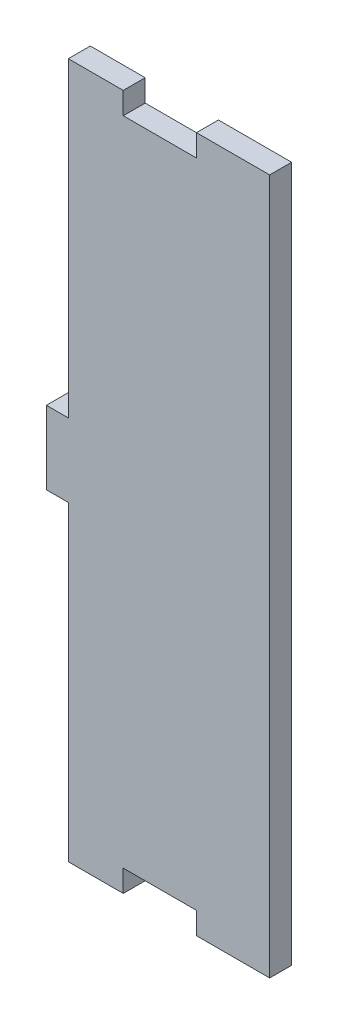
ISO-10303-21;
HEADER;
FILE_DESCRIPTION(('STEP AP214'),'2;1');
FILE_NAME('part.step','',(''),(''),'','','');
FILE_SCHEMA(('AUTOMOTIVE_DESIGN { 1 0 10303 214 1 1 1 1 }'));
ENDSEC;
DATA;
#1=APPLICATION_CONTEXT('core data for automotive mechanical design processes');
#2=APPLICATION_PROTOCOL_DEFINITION('international standard','automotive_design',2000,#1);
#3=PRODUCT_CONTEXT('',#1,'mechanical');
#4=PRODUCT('Part','Part','',(#3));
#5=PRODUCT_RELATED_PRODUCT_CATEGORY('part','',(#4));
#6=PRODUCT_DEFINITION_FORMATION('','',#4);
#7=PRODUCT_DEFINITION_CONTEXT('part definition',#1,'design');
#8=PRODUCT_DEFINITION('design','',#6,#7);
#9=PRODUCT_DEFINITION_SHAPE('','',#8);
#10=(LENGTH_UNIT() NAMED_UNIT(*) SI_UNIT(.MILLI.,.METRE.));
#11=(NAMED_UNIT(*) PLANE_ANGLE_UNIT() SI_UNIT($,.RADIAN.));
#12=(NAMED_UNIT(*) SI_UNIT($,.STERADIAN.) SOLID_ANGLE_UNIT());
#13=UNCERTAINTY_MEASURE_WITH_UNIT(LENGTH_MEASURE(1.E-05),#10,'distance_accuracy_value','');
#14=(GEOMETRIC_REPRESENTATION_CONTEXT(3) GLOBAL_UNCERTAINTY_ASSIGNED_CONTEXT((#13)) GLOBAL_UNIT_ASSIGNED_CONTEXT((#10,
#11,#12)) REPRESENTATION_CONTEXT('',''));
#15=CARTESIAN_POINT('',(0.,0.,0.));
#16=DIRECTION('',(0.,0.,1.));
#17=DIRECTION('',(1.,0.,0.));
#18=AXIS2_PLACEMENT_3D('',#15,#16,#17);
#19=CARTESIAN_POINT('',(7.4999999999999,47.5000000000008,3.));
#20=DIRECTION('',(0.,-1.,0.));
#21=DIRECTION('',(1.,0.,0.));
#22=AXIS2_PLACEMENT_3D('',#19,#20,#21);
#23=PLANE('',#22);
#24=DIRECTION('',(-1.,0.,0.));
#25=VECTOR('',#24,1.);
#26=CARTESIAN_POINT('',(7.4999999999999,47.5000000000008,0.));
#27=LINE('',#26,#25);
#28=CARTESIAN_POINT('',(17.5,47.5,0.));
#29=VERTEX_POINT('',#28);
#30=CARTESIAN_POINT('',(7.4999999999999,47.5000000000008,0.));
#31=VERTEX_POINT('',#30);
#32=EDGE_CURVE('E182',#29,#31,#27,.T.);
#33=ORIENTED_EDGE('',*,*,#32,.T.);
#34=DIRECTION('',(0.,0.,-1.));
#35=VECTOR('',#34,1.);
#36=CARTESIAN_POINT('',(7.4999999999999,47.5000000000008,3.));
#37=LINE('',#36,#35);
#38=CARTESIAN_POINT('',(7.4999999999999,47.5000000000008,3.));
#39=VERTEX_POINT('',#38);
#40=EDGE_CURVE('E11',#39,#31,#37,.T.);
#41=ORIENTED_EDGE('',*,*,#40,.F.);
#42=DIRECTION('',(-1.,0.,0.));
#43=VECTOR('',#42,1.);
#44=CARTESIAN_POINT('',(7.4999999999999,47.5000000000008,3.));
#45=LINE('',#44,#43);
#46=CARTESIAN_POINT('',(17.5,47.5,3.));
#47=VERTEX_POINT('',#46);
#48=EDGE_CURVE('E213',#47,#39,#45,.T.);
#49=ORIENTED_EDGE('',*,*,#48,.F.);
#50=DIRECTION('',(0.,0.,-1.));
#51=VECTOR('',#50,1.);
#52=CARTESIAN_POINT('',(17.5,47.5,3.));
#53=LINE('',#52,#51);
#54=EDGE_CURVE('E178',#47,#29,#53,.T.);
#55=ORIENTED_EDGE('',*,*,#54,.T.);
#56=EDGE_LOOP('',(#33,#41,#49,#55));
#57=FACE_BOUND('',#56,.T.);
#58=ADVANCED_FACE('F37',(#57),#23,.F.);
#59=CARTESIAN_POINT('',(7.4999999999999,47.5000000000008,3.));
#60=DIRECTION('',(1.,0.,0.));
#61=DIRECTION('',(0.,0.,-1.));
#62=AXIS2_PLACEMENT_3D('',#59,#60,#61);
#63=PLANE('',#62);
#64=DIRECTION('',(0.,-1.,0.));
#65=VECTOR('',#64,1.);
#66=CARTESIAN_POINT('',(7.4999999999999,47.5000000000008,0.));
#67=LINE('',#66,#65);
#68=CARTESIAN_POINT('',(7.4999999999999,44.5000000000008,0.));
#69=VERTEX_POINT('',#68);
#70=EDGE_CURVE('E185',#31,#69,#67,.T.);
#71=ORIENTED_EDGE('',*,*,#70,.T.);
#72=DIRECTION('',(0.,0.,-1.));
#73=VECTOR('',#72,1.);
#74=CARTESIAN_POINT('',(7.4999999999999,44.5000000000008,3.));
#75=LINE('',#74,#73);
#76=CARTESIAN_POINT('',(7.4999999999999,44.5000000000008,3.));
#77=VERTEX_POINT('',#76);
#78=EDGE_CURVE('E45',#77,#69,#75,.T.);
#79=ORIENTED_EDGE('',*,*,#78,.F.);
#80=DIRECTION('',(0.,-1.,0.));
#81=VECTOR('',#80,1.);
#82=CARTESIAN_POINT('',(7.4999999999999,47.5000000000008,3.));
#83=LINE('',#82,#81);
#84=EDGE_CURVE('E118',#39,#77,#83,.T.);
#85=ORIENTED_EDGE('',*,*,#84,.F.);
#86=ORIENTED_EDGE('',*,*,#40,.T.);
#87=EDGE_LOOP('',(#71,#79,#85,#86));
#88=FACE_BOUND('',#87,.T.);
#89=ADVANCED_FACE('F301',(#88),#63,.F.);
#90=CARTESIAN_POINT('',(-2.5000000000001,44.5000000000008,3.));
#91=DIRECTION('',(0.,-1.,0.));
#92=DIRECTION('',(0.,0.,-1.));
#93=AXIS2_PLACEMENT_3D('',#90,#91,#92);
#94=PLANE('',#93);
#95=DIRECTION('',(-1.,0.,0.));
#96=VECTOR('',#95,1.);
#97=CARTESIAN_POINT('',(-2.5000000000001,44.5000000000008,0.));
#98=LINE('',#97,#96);
#99=CARTESIAN_POINT('',(-2.5000000000001,44.5000000000008,0.));
#100=VERTEX_POINT('',#99);
#101=EDGE_CURVE('E187',#69,#100,#98,.T.);
#102=ORIENTED_EDGE('',*,*,#101,.T.);
#103=DIRECTION('',(0.,0.,-1.));
#104=VECTOR('',#103,1.);
#105=CARTESIAN_POINT('',(-2.5000000000001,44.5000000000008,3.));
#106=LINE('',#105,#104);
#107=CARTESIAN_POINT('',(-2.5000000000001,44.5000000000008,3.));
#108=VERTEX_POINT('',#107);
#109=EDGE_CURVE('E244',#108,#100,#106,.T.);
#110=ORIENTED_EDGE('',*,*,#109,.F.);
#111=DIRECTION('',(-1.,0.,0.));
#112=VECTOR('',#111,1.);
#113=CARTESIAN_POINT('',(-2.5000000000001,44.5000000000008,3.));
#114=LINE('',#113,#112);
#115=EDGE_CURVE('E252',#77,#108,#114,.T.);
#116=ORIENTED_EDGE('',*,*,#115,.F.);
#117=ORIENTED_EDGE('',*,*,#78,.T.);
#118=EDGE_LOOP('',(#102,#110,#116,#117));
#119=FACE_BOUND('',#118,.T.);
#120=ADVANCED_FACE('F250',(#119),#94,.F.);
#121=CARTESIAN_POINT('',(-2.5000000000001,47.5000000000008,3.));
#122=DIRECTION('',(-1.,0.,0.));
#123=DIRECTION('',(0.,0.,1.));
#124=AXIS2_PLACEMENT_3D('',#121,#122,#123);
#125=PLANE('',#124);
#126=DIRECTION('',(0.,1.,0.));
#127=VECTOR('',#126,1.);
#128=CARTESIAN_POINT('',(-2.5000000000001,47.5000000000008,0.));
#129=LINE('',#128,#127);
#130=CARTESIAN_POINT('',(-2.5000000000001,47.5000000000008,0.));
#131=VERTEX_POINT('',#130);
#132=EDGE_CURVE('E189',#100,#131,#129,.T.);
#133=ORIENTED_EDGE('',*,*,#132,.T.);
#134=DIRECTION('',(0.,0.,-1.));
#135=VECTOR('',#134,1.);
#136=CARTESIAN_POINT('',(-2.5000000000001,47.5000000000008,3.));
#137=LINE('',#136,#135);
#138=CARTESIAN_POINT('',(-2.5000000000001,47.5000000000008,3.));
#139=VERTEX_POINT('',#138);
#140=EDGE_CURVE('E241',#139,#131,#137,.T.);
#141=ORIENTED_EDGE('',*,*,#140,.F.);
#142=DIRECTION('',(0.,1.,0.));
#143=VECTOR('',#142,1.);
#144=CARTESIAN_POINT('',(-2.5000000000001,47.5000000000008,3.));
#145=LINE('',#144,#143);
#146=EDGE_CURVE('E268',#108,#139,#145,.T.);
#147=ORIENTED_EDGE('',*,*,#146,.F.);
#148=ORIENTED_EDGE('',*,*,#109,.T.);
#149=EDGE_LOOP('',(#133,#141,#147,#148));
#150=FACE_BOUND('',#149,.T.);
#151=ADVANCED_FACE('F259',(#150),#125,.F.);
#152=CARTESIAN_POINT('',(-10.,47.5,3.));
#153=DIRECTION('',(1.06396373193246E-13,-1.,0.));
#154=DIRECTION('',(1.,1.06396373193246E-13,0.));
#155=AXIS2_PLACEMENT_3D('',#152,#153,#154);
#156=PLANE('',#155);
#157=DIRECTION('',(-1.,-1.06396373193246E-13,0.));
#158=VECTOR('',#157,1.);
#159=CARTESIAN_POINT('',(-10.,47.5,0.));
#160=LINE('',#159,#158);
#161=CARTESIAN_POINT('',(-10.,47.5,0.));
#162=VERTEX_POINT('',#161);
#163=EDGE_CURVE('E191',#131,#162,#160,.T.);
#164=ORIENTED_EDGE('',*,*,#163,.T.);
#165=DIRECTION('',(0.,0.,-1.));
#166=VECTOR('',#165,1.);
#167=CARTESIAN_POINT('',(-10.,47.5,3.));
#168=LINE('',#167,#166);
#169=CARTESIAN_POINT('',(-10.,47.5,3.));
#170=VERTEX_POINT('',#169);
#171=EDGE_CURVE('E238',#170,#162,#168,.T.);
#172=ORIENTED_EDGE('',*,*,#171,.F.);
#173=DIRECTION('',(-1.,-1.06396373193246E-13,0.));
#174=VECTOR('',#173,1.);
#175=CARTESIAN_POINT('',(-10.,47.5,3.));
#176=LINE('',#175,#174);
#177=EDGE_CURVE('E265',#139,#170,#176,.T.);
#178=ORIENTED_EDGE('',*,*,#177,.F.);
#179=ORIENTED_EDGE('',*,*,#140,.T.);
#180=EDGE_LOOP('',(#164,#172,#178,#179));
#181=FACE_BOUND('',#180,.T.);
#182=ADVANCED_FACE('F263',(#181),#156,.F.);
#183=CARTESIAN_POINT('',(-10.,47.5,3.));
#184=DIRECTION('',(1.,0.,0.));
#185=DIRECTION('',(0.,1.,0.));
#186=AXIS2_PLACEMENT_3D('',#183,#184,#185);
#187=PLANE('',#186);
#188=DIRECTION('',(0.,-1.,0.));
#189=VECTOR('',#188,1.);
#190=CARTESIAN_POINT('',(-10.,47.5,0.));
#191=LINE('',#190,#189);
#192=CARTESIAN_POINT('',(-10.,4.99999999999999,0.));
#193=VERTEX_POINT('',#192);
#194=EDGE_CURVE('E193',#162,#193,#191,.T.);
#195=ORIENTED_EDGE('',*,*,#194,.T.);
#196=DIRECTION('',(0.,0.,-1.));
#197=VECTOR('',#196,1.);
#198=CARTESIAN_POINT('',(-10.,4.99999999999999,3.));
#199=LINE('',#198,#197);
#200=CARTESIAN_POINT('',(-10.,4.99999999999999,3.));
#201=VERTEX_POINT('',#200);
#202=EDGE_CURVE('E235',#201,#193,#199,.T.);
#203=ORIENTED_EDGE('',*,*,#202,.F.);
#204=DIRECTION('',(0.,-1.,0.));
#205=VECTOR('',#204,1.);
#206=CARTESIAN_POINT('',(-10.,47.5,3.));
#207=LINE('',#206,#205);
#208=EDGE_CURVE('E267',#170,#201,#207,.T.);
#209=ORIENTED_EDGE('',*,*,#208,.F.);
#210=ORIENTED_EDGE('',*,*,#171,.T.);
#211=EDGE_LOOP('',(#195,#203,#209,#210));
#212=FACE_BOUND('',#211,.T.);
#213=ADVANCED_FACE('F313',(#212),#187,.F.);
#214=CARTESIAN_POINT('',(-13.,5.,3.));
#215=DIRECTION('',(0.,-1.,0.));
#216=DIRECTION('',(1.,0.,0.));
#217=AXIS2_PLACEMENT_3D('',#214,#215,#216);
#218=PLANE('',#217);
#219=DIRECTION('',(-1.,0.,0.));
#220=VECTOR('',#219,1.);
#221=CARTESIAN_POINT('',(-13.,5.,0.));
#222=LINE('',#221,#220);
#223=CARTESIAN_POINT('',(-13.,5.,0.));
#224=VERTEX_POINT('',#223);
#225=EDGE_CURVE('E195',#193,#224,#222,.T.);
#226=ORIENTED_EDGE('',*,*,#225,.T.);
#227=DIRECTION('',(0.,0.,-1.));
#228=VECTOR('',#227,1.);
#229=CARTESIAN_POINT('',(-13.,5.,3.));
#230=LINE('',#229,#228);
#231=CARTESIAN_POINT('',(-13.,5.,3.));
#232=VERTEX_POINT('',#231);
#233=EDGE_CURVE('E232',#232,#224,#230,.T.);
#234=ORIENTED_EDGE('',*,*,#233,.F.);
#235=DIRECTION('',(-1.,0.,0.));
#236=VECTOR('',#235,1.);
#237=CARTESIAN_POINT('',(-13.,5.,3.));
#238=LINE('',#237,#236);
#239=EDGE_CURVE('E270',#201,#232,#238,.T.);
#240=ORIENTED_EDGE('',*,*,#239,.F.);
#241=ORIENTED_EDGE('',*,*,#202,.T.);
#242=EDGE_LOOP('',(#226,#234,#240,#241));
#243=FACE_BOUND('',#242,.T.);
#244=ADVANCED_FACE('F316',(#243),#218,.F.);
#245=CARTESIAN_POINT('',(-13.,-5.,3.));
#246=DIRECTION('',(1.,0.,0.));
#247=DIRECTION('',(0.,0.,-1.));
#248=AXIS2_PLACEMENT_3D('',#245,#246,#247);
#249=PLANE('',#248);
#250=DIRECTION('',(0.,-1.,0.));
#251=VECTOR('',#250,1.);
#252=CARTESIAN_POINT('',(-13.,-5.,0.));
#253=LINE('',#252,#251);
#254=CARTESIAN_POINT('',(-13.,-5.,0.));
#255=VERTEX_POINT('',#254);
#256=EDGE_CURVE('E197',#224,#255,#253,.T.);
#257=ORIENTED_EDGE('',*,*,#256,.T.);
#258=DIRECTION('',(0.,0.,-1.));
#259=VECTOR('',#258,1.);
#260=CARTESIAN_POINT('',(-13.,-5.,3.));
#261=LINE('',#260,#259);
#262=CARTESIAN_POINT('',(-13.,-5.,3.));
#263=VERTEX_POINT('',#262);
#264=EDGE_CURVE('E229',#263,#255,#261,.T.);
#265=ORIENTED_EDGE('',*,*,#264,.F.);
#266=DIRECTION('',(0.,-1.,0.));
#267=VECTOR('',#266,1.);
#268=CARTESIAN_POINT('',(-13.,-5.,3.));
#269=LINE('',#268,#267);
#270=EDGE_CURVE('E276',#232,#263,#269,.T.);
#271=ORIENTED_EDGE('',*,*,#270,.F.);
#272=ORIENTED_EDGE('',*,*,#233,.T.);
#273=EDGE_LOOP('',(#257,#265,#271,#272));
#274=FACE_BOUND('',#273,.T.);
#275=ADVANCED_FACE('F320',(#274),#249,.F.);
#276=CARTESIAN_POINT('',(-13.,-5.,3.));
#277=DIRECTION('',(0.,1.,0.));
#278=DIRECTION('',(-1.,0.,0.));
#279=AXIS2_PLACEMENT_3D('',#276,#277,#278);
#280=PLANE('',#279);
#281=DIRECTION('',(1.,0.,0.));
#282=VECTOR('',#281,1.);
#283=CARTESIAN_POINT('',(-13.,-5.,0.));
#284=LINE('',#283,#282);
#285=CARTESIAN_POINT('',(-10.,-5.00000000000001,0.));
#286=VERTEX_POINT('',#285);
#287=EDGE_CURVE('E199',#255,#286,#284,.T.);
#288=ORIENTED_EDGE('',*,*,#287,.T.);
#289=DIRECTION('',(0.,0.,-1.));
#290=VECTOR('',#289,1.);
#291=CARTESIAN_POINT('',(-10.,-5.00000000000001,3.));
#292=LINE('',#291,#290);
#293=CARTESIAN_POINT('',(-10.,-5.00000000000001,3.));
#294=VERTEX_POINT('',#293);
#295=EDGE_CURVE('E226',#294,#286,#292,.T.);
#296=ORIENTED_EDGE('',*,*,#295,.F.);
#297=DIRECTION('',(1.,0.,0.));
#298=VECTOR('',#297,1.);
#299=CARTESIAN_POINT('',(-13.,-5.,3.));
#300=LINE('',#299,#298);
#301=EDGE_CURVE('E278',#263,#294,#300,.T.);
#302=ORIENTED_EDGE('',*,*,#301,.F.);
#303=ORIENTED_EDGE('',*,*,#264,.T.);
#304=EDGE_LOOP('',(#288,#296,#302,#303));
#305=FACE_BOUND('',#304,.T.);
#306=ADVANCED_FACE('F324',(#305),#280,.F.);
#307=CARTESIAN_POINT('',(-10.,-5.00000000000001,3.));
#308=DIRECTION('',(1.,0.,0.));
#309=DIRECTION('',(0.,1.,0.));
#310=AXIS2_PLACEMENT_3D('',#307,#308,#309);
#311=PLANE('',#310);
#312=DIRECTION('',(0.,-1.,0.));
#313=VECTOR('',#312,1.);
#314=CARTESIAN_POINT('',(-10.,-5.00000000000001,0.));
#315=LINE('',#314,#313);
#316=CARTESIAN_POINT('',(-10.,-47.4999999999989,0.));
#317=VERTEX_POINT('',#316);
#318=EDGE_CURVE('E201',#286,#317,#315,.T.);
#319=ORIENTED_EDGE('',*,*,#318,.T.);
#320=DIRECTION('',(0.,0.,-1.));
#321=VECTOR('',#320,1.);
#322=CARTESIAN_POINT('',(-10.,-47.4999999999989,3.));
#323=LINE('',#322,#321);
#324=CARTESIAN_POINT('',(-10.,-47.4999999999989,3.));
#325=VERTEX_POINT('',#324);
#326=EDGE_CURVE('E223',#325,#317,#323,.T.);
#327=ORIENTED_EDGE('',*,*,#326,.F.);
#328=DIRECTION('',(0.,-1.,0.));
#329=VECTOR('',#328,1.);
#330=CARTESIAN_POINT('',(-10.,-5.00000000000001,3.));
#331=LINE('',#330,#329);
#332=EDGE_CURVE('E280',#294,#325,#331,.T.);
#333=ORIENTED_EDGE('',*,*,#332,.F.);
#334=ORIENTED_EDGE('',*,*,#295,.T.);
#335=EDGE_LOOP('',(#319,#327,#333,#334));
#336=FACE_BOUND('',#335,.T.);
#337=ADVANCED_FACE('F328',(#336),#311,.F.);
#338=CARTESIAN_POINT('',(-10.,-47.4999999999989,3.));
#339=DIRECTION('',(0.,1.,0.));
#340=DIRECTION('',(0.,0.,1.));
#341=AXIS2_PLACEMENT_3D('',#338,#339,#340);
#342=PLANE('',#341);
#343=DIRECTION('',(1.,0.,0.));
#344=VECTOR('',#343,1.);
#345=CARTESIAN_POINT('',(-10.,-47.4999999999989,0.));
#346=LINE('',#345,#344);
#347=CARTESIAN_POINT('',(-2.49999999999966,-47.4999999999989,0.));
#348=VERTEX_POINT('',#347);
#349=EDGE_CURVE('E203',#317,#348,#346,.T.);
#350=ORIENTED_EDGE('',*,*,#349,.T.);
#351=DIRECTION('',(0.,0.,-1.));
#352=VECTOR('',#351,1.);
#353=CARTESIAN_POINT('',(-2.49999999999966,-47.4999999999989,3.));
#354=LINE('',#353,#352);
#355=CARTESIAN_POINT('',(-2.49999999999966,-47.4999999999989,3.));
#356=VERTEX_POINT('',#355);
#357=EDGE_CURVE('E220',#356,#348,#354,.T.);
#358=ORIENTED_EDGE('',*,*,#357,.F.);
#359=DIRECTION('',(1.,0.,0.));
#360=VECTOR('',#359,1.);
#361=CARTESIAN_POINT('',(-10.,-47.4999999999989,3.));
#362=LINE('',#361,#360);
#363=EDGE_CURVE('E282',#325,#356,#362,.T.);
#364=ORIENTED_EDGE('',*,*,#363,.F.);
#365=ORIENTED_EDGE('',*,*,#326,.T.);
#366=EDGE_LOOP('',(#350,#358,#364,#365));
#367=FACE_BOUND('',#366,.T.);
#368=ADVANCED_FACE('F332',(#367),#342,.F.);
#369=CARTESIAN_POINT('',(-2.49999999999966,-44.4999999999909,3.));
#370=DIRECTION('',(-1.,0.,0.));
#371=DIRECTION('',(0.,0.,1.));
#372=AXIS2_PLACEMENT_3D('',#369,#370,#371);
#373=PLANE('',#372);
#374=DIRECTION('',(0.,1.,0.));
#375=VECTOR('',#374,1.);
#376=CARTESIAN_POINT('',(-2.49999999999966,-44.4999999999909,0.));
#377=LINE('',#376,#375);
#378=CARTESIAN_POINT('',(-2.49999999999966,-44.4999999999909,0.));
#379=VERTEX_POINT('',#378);
#380=EDGE_CURVE('E205',#348,#379,#377,.T.);
#381=ORIENTED_EDGE('',*,*,#380,.T.);
#382=DIRECTION('',(0.,0.,-1.));
#383=VECTOR('',#382,1.);
#384=CARTESIAN_POINT('',(-2.49999999999966,-44.4999999999909,3.));
#385=LINE('',#384,#383);
#386=CARTESIAN_POINT('',(-2.49999999999966,-44.4999999999909,3.));
#387=VERTEX_POINT('',#386);
#388=EDGE_CURVE('E217',#387,#379,#385,.T.);
#389=ORIENTED_EDGE('',*,*,#388,.F.);
#390=DIRECTION('',(0.,1.,0.));
#391=VECTOR('',#390,1.);
#392=CARTESIAN_POINT('',(-2.49999999999966,-44.4999999999909,3.));
#393=LINE('',#392,#391);
#394=EDGE_CURVE('E284',#356,#387,#393,.T.);
#395=ORIENTED_EDGE('',*,*,#394,.F.);
#396=ORIENTED_EDGE('',*,*,#357,.T.);
#397=EDGE_LOOP('',(#381,#389,#395,#396));
#398=FACE_BOUND('',#397,.T.);
#399=ADVANCED_FACE('F290',(#398),#373,.F.);
#400=CARTESIAN_POINT('',(-2.49999999999966,-44.4999999999909,3.));
#401=DIRECTION('',(0.,1.,0.));
#402=DIRECTION('',(0.,0.,1.));
#403=AXIS2_PLACEMENT_3D('',#400,#401,#402);
#404=PLANE('',#403);
#405=DIRECTION('',(1.,0.,0.));
#406=VECTOR('',#405,1.);
#407=CARTESIAN_POINT('',(-2.49999999999966,-44.4999999999909,0.));
#408=LINE('',#407,#406);
#409=CARTESIAN_POINT('',(7.49999999999998,-44.4999999999909,0.));
#410=VERTEX_POINT('',#409);
#411=EDGE_CURVE('E207',#379,#410,#408,.T.);
#412=ORIENTED_EDGE('',*,*,#411,.T.);
#413=DIRECTION('',(0.,0.,-1.));
#414=VECTOR('',#413,1.);
#415=CARTESIAN_POINT('',(7.49999999999998,-44.4999999999909,3.));
#416=LINE('',#415,#414);
#417=CARTESIAN_POINT('',(7.49999999999998,-44.4999999999909,3.));
#418=VERTEX_POINT('',#417);
#419=EDGE_CURVE('E173',#418,#410,#416,.T.);
#420=ORIENTED_EDGE('',*,*,#419,.F.);
#421=DIRECTION('',(1.,0.,0.));
#422=VECTOR('',#421,1.);
#423=CARTESIAN_POINT('',(-2.49999999999966,-44.4999999999909,3.));
#424=LINE('',#423,#422);
#425=EDGE_CURVE('E162',#387,#418,#424,.T.);
#426=ORIENTED_EDGE('',*,*,#425,.F.);
#427=ORIENTED_EDGE('',*,*,#388,.T.);
#428=EDGE_LOOP('',(#412,#420,#426,#427));
#429=FACE_BOUND('',#428,.T.);
#430=ADVANCED_FACE('F294',(#429),#404,.F.);
#431=CARTESIAN_POINT('',(7.49999999999998,-44.4999999999909,3.));
#432=DIRECTION('',(1.,0.,0.));
#433=DIRECTION('',(0.,0.,-1.));
#434=AXIS2_PLACEMENT_3D('',#431,#432,#433);
#435=PLANE('',#434);
#436=DIRECTION('',(0.,-1.,0.));
#437=VECTOR('',#436,1.);
#438=CARTESIAN_POINT('',(7.49999999999998,-44.4999999999909,0.));
#439=LINE('',#438,#437);
#440=CARTESIAN_POINT('',(7.49999999999998,-47.5,0.));
#441=VERTEX_POINT('',#440);
#442=EDGE_CURVE('E171',#410,#441,#439,.T.);
#443=ORIENTED_EDGE('',*,*,#442,.T.);
#444=DIRECTION('',(0.,0.,-1.));
#445=VECTOR('',#444,1.);
#446=CARTESIAN_POINT('',(7.49999999999998,-47.5,3.));
#447=LINE('',#446,#445);
#448=CARTESIAN_POINT('',(7.49999999999998,-47.5,3.));
#449=VERTEX_POINT('',#448);
#450=EDGE_CURVE('E168',#449,#441,#447,.T.);
#451=ORIENTED_EDGE('',*,*,#450,.F.);
#452=DIRECTION('',(0.,-1.,0.));
#453=VECTOR('',#452,1.);
#454=CARTESIAN_POINT('',(7.49999999999998,-44.4999999999909,3.));
#455=LINE('',#454,#453);
#456=EDGE_CURVE('E155',#418,#449,#455,.T.);
#457=ORIENTED_EDGE('',*,*,#456,.F.);
#458=ORIENTED_EDGE('',*,*,#419,.T.);
#459=EDGE_LOOP('',(#443,#451,#457,#458));
#460=FACE_BOUND('',#459,.T.);
#461=ADVANCED_FACE('F169',(#460),#435,.F.);
#462=CARTESIAN_POINT('',(17.5,-47.5,3.));
#463=DIRECTION('',(0.,1.,0.));
#464=DIRECTION('',(0.,0.,1.));
#465=AXIS2_PLACEMENT_3D('',#462,#463,#464);
#466=PLANE('',#465);
#467=DIRECTION('',(1.,0.,0.));
#468=VECTOR('',#467,1.);
#469=CARTESIAN_POINT('',(17.5,-47.5,0.));
#470=LINE('',#469,#468);
#471=CARTESIAN_POINT('',(17.5,-47.5,0.));
#472=VERTEX_POINT('',#471);
#473=EDGE_CURVE('E210',#441,#472,#470,.T.);
#474=ORIENTED_EDGE('',*,*,#473,.T.);
#475=DIRECTION('',(0.,0.,-1.));
#476=VECTOR('',#475,1.);
#477=CARTESIAN_POINT('',(17.5,-47.5,3.));
#478=LINE('',#477,#476);
#479=CARTESIAN_POINT('',(17.5,-47.5,3.));
#480=VERTEX_POINT('',#479);
#481=EDGE_CURVE('E174',#480,#472,#478,.T.);
#482=ORIENTED_EDGE('',*,*,#481,.F.);
#483=DIRECTION('',(1.,0.,0.));
#484=VECTOR('',#483,1.);
#485=CARTESIAN_POINT('',(17.5,-47.5,3.));
#486=LINE('',#485,#484);
#487=EDGE_CURVE('E159',#449,#480,#486,.T.);
#488=ORIENTED_EDGE('',*,*,#487,.F.);
#489=ORIENTED_EDGE('',*,*,#450,.T.);
#490=EDGE_LOOP('',(#474,#482,#488,#489));
#491=FACE_BOUND('',#490,.T.);
#492=ADVANCED_FACE('F176',(#491),#466,.F.);
#493=CARTESIAN_POINT('',(17.5,47.5,3.));
#494=DIRECTION('',(-1.,0.,0.));
#495=DIRECTION('',(0.,-1.,0.));
#496=AXIS2_PLACEMENT_3D('',#493,#494,#495);
#497=PLANE('',#496);
#498=DIRECTION('',(0.,1.,0.));
#499=VECTOR('',#498,1.);
#500=CARTESIAN_POINT('',(17.5,47.5,0.));
#501=LINE('',#500,#499);
#502=EDGE_CURVE('E106',#472,#29,#501,.T.);
#503=ORIENTED_EDGE('',*,*,#502,.T.);
#504=ORIENTED_EDGE('',*,*,#54,.F.);
#505=DIRECTION('',(0.,1.,0.));
#506=VECTOR('',#505,1.);
#507=CARTESIAN_POINT('',(17.5,-12.5,3.));
#508=LINE('',#507,#506);
#509=EDGE_CURVE('E53',#480,#47,#508,.T.);
#510=ORIENTED_EDGE('',*,*,#509,.F.);
#511=ORIENTED_EDGE('',*,*,#481,.T.);
#512=EDGE_LOOP('',(#503,#504,#510,#511));
#513=FACE_BOUND('',#512,.T.);
#514=ADVANCED_FACE('F295',(#513),#497,.F.);
#515=CARTESIAN_POINT('',(0.,0.,3.));
#516=DIRECTION('',(0.,0.,-1.));
#517=DIRECTION('',(-1.,0.,0.));
#518=AXIS2_PLACEMENT_3D('',#515,#516,#517);
#519=PLANE('',#518);
#520=ORIENTED_EDGE('',*,*,#48,.T.);
#521=ORIENTED_EDGE('',*,*,#84,.T.);
#522=ORIENTED_EDGE('',*,*,#115,.T.);
#523=ORIENTED_EDGE('',*,*,#146,.T.);
#524=ORIENTED_EDGE('',*,*,#177,.T.);
#525=ORIENTED_EDGE('',*,*,#208,.T.);
#526=ORIENTED_EDGE('',*,*,#239,.T.);
#527=ORIENTED_EDGE('',*,*,#270,.T.);
#528=ORIENTED_EDGE('',*,*,#301,.T.);
#529=ORIENTED_EDGE('',*,*,#332,.T.);
#530=ORIENTED_EDGE('',*,*,#363,.T.);
#531=ORIENTED_EDGE('',*,*,#394,.T.);
#532=ORIENTED_EDGE('',*,*,#425,.T.);
#533=ORIENTED_EDGE('',*,*,#456,.T.);
#534=ORIENTED_EDGE('',*,*,#487,.T.);
#535=ORIENTED_EDGE('',*,*,#509,.T.);
#536=EDGE_LOOP('',(#520,#521,#522,#523,#524,#525,#526,#527,#528,#529,#530,#531,#532,#533,#534,#535));
#537=FACE_BOUND('',#536,.T.);
#538=ADVANCED_FACE('F157',(#537),#519,.F.);
#539=CARTESIAN_POINT('',(0.,0.,0.));
#540=DIRECTION('',(0.,0.,-1.));
#541=DIRECTION('',(-1.,0.,0.));
#542=AXIS2_PLACEMENT_3D('',#539,#540,#541);
#543=PLANE('',#542);
#544=ORIENTED_EDGE('',*,*,#32,.F.);
#545=ORIENTED_EDGE('',*,*,#502,.F.);
#546=ORIENTED_EDGE('',*,*,#473,.F.);
#547=ORIENTED_EDGE('',*,*,#442,.F.);
#548=ORIENTED_EDGE('',*,*,#411,.F.);
#549=ORIENTED_EDGE('',*,*,#380,.F.);
#550=ORIENTED_EDGE('',*,*,#349,.F.);
#551=ORIENTED_EDGE('',*,*,#318,.F.);
#552=ORIENTED_EDGE('',*,*,#287,.F.);
#553=ORIENTED_EDGE('',*,*,#256,.F.);
#554=ORIENTED_EDGE('',*,*,#225,.F.);
#555=ORIENTED_EDGE('',*,*,#194,.F.);
#556=ORIENTED_EDGE('',*,*,#163,.F.);
#557=ORIENTED_EDGE('',*,*,#132,.F.);
#558=ORIENTED_EDGE('',*,*,#101,.F.);
#559=ORIENTED_EDGE('',*,*,#70,.F.);
#560=EDGE_LOOP('',(#544,#545,#546,#547,#548,#549,#550,#551,#552,#553,#554,#555,#556,#557,#558,#559));
#561=FACE_BOUND('',#560,.T.);
#562=ADVANCED_FACE('F254',(#561),#543,.T.);
#563=CLOSED_SHELL('',(#58,#89,#120,#151,#182,#213,#244,#275,#306,#337,#368,#399,#430,#461,#492,
#514,#538,#562));
#564=MANIFOLD_SOLID_BREP('B2',#563);
#565=ADVANCED_BREP_SHAPE_REPRESENTATION('',(#18,#564),#14);
#566=SHAPE_DEFINITION_REPRESENTATION(#9,#565);
ENDSEC;
END-ISO-10303-21;
